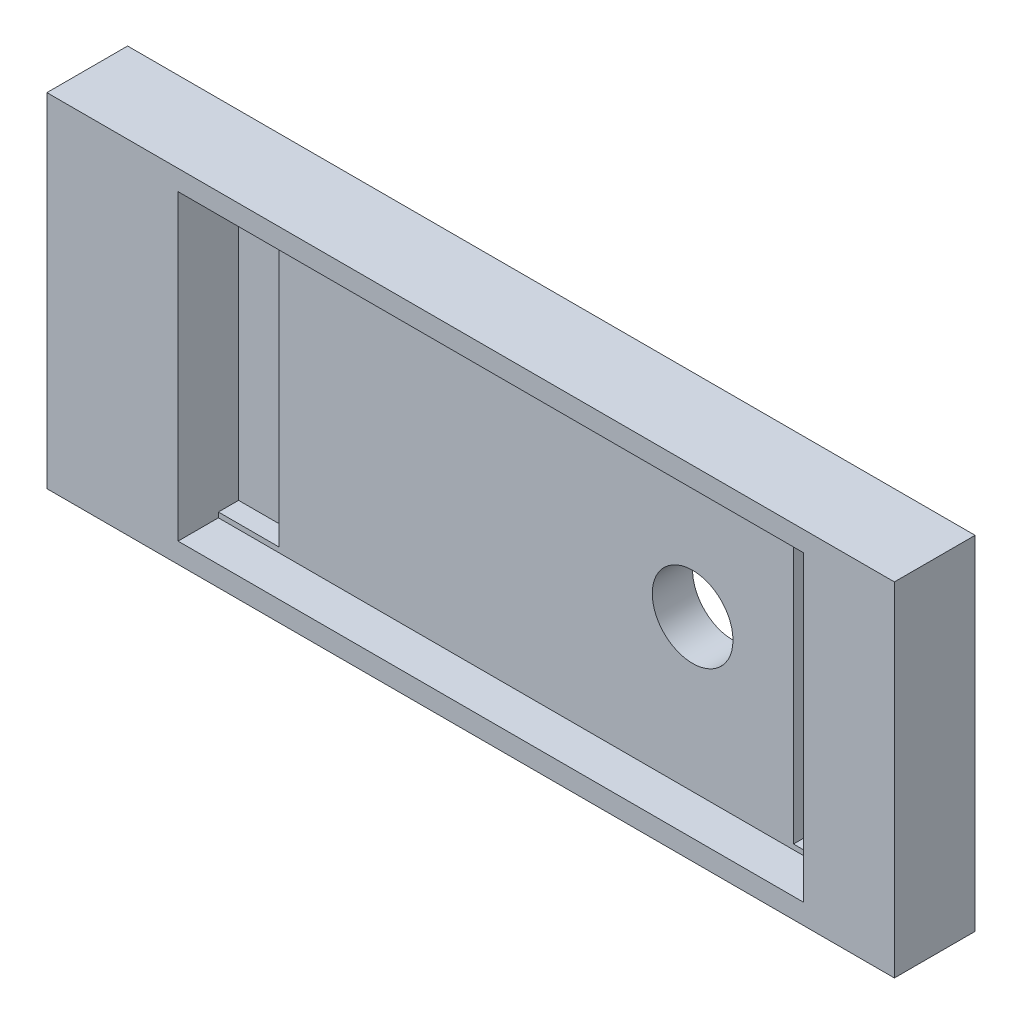
ISO-10303-21;
HEADER;
FILE_DESCRIPTION(('STEP AP214'),'2;1');
FILE_NAME('part.step','',(''),(''),'','','');
FILE_SCHEMA(('AUTOMOTIVE_DESIGN { 1 0 10303 214 1 1 1 1 }'));
ENDSEC;
DATA;
#1=APPLICATION_CONTEXT('core data for automotive mechanical design processes');
#2=APPLICATION_PROTOCOL_DEFINITION('international standard','automotive_design',2000,#1);
#3=PRODUCT_CONTEXT('',#1,'mechanical');
#4=PRODUCT('Part','Part','',(#3));
#5=PRODUCT_RELATED_PRODUCT_CATEGORY('part','',(#4));
#6=PRODUCT_DEFINITION_FORMATION('','',#4);
#7=PRODUCT_DEFINITION_CONTEXT('part definition',#1,'design');
#8=PRODUCT_DEFINITION('design','',#6,#7);
#9=PRODUCT_DEFINITION_SHAPE('','',#8);
#10=(LENGTH_UNIT() NAMED_UNIT(*) SI_UNIT(.MILLI.,.METRE.));
#11=(NAMED_UNIT(*) PLANE_ANGLE_UNIT() SI_UNIT($,.RADIAN.));
#12=(NAMED_UNIT(*) SI_UNIT($,.STERADIAN.) SOLID_ANGLE_UNIT());
#13=UNCERTAINTY_MEASURE_WITH_UNIT(LENGTH_MEASURE(1.E-05),#10,'distance_accuracy_value','');
#14=(GEOMETRIC_REPRESENTATION_CONTEXT(3) GLOBAL_UNCERTAINTY_ASSIGNED_CONTEXT((#13)) GLOBAL_UNIT_ASSIGNED_CONTEXT((#10,
#11,#12)) REPRESENTATION_CONTEXT('',''));
#15=CARTESIAN_POINT('',(0.,0.,0.));
#16=DIRECTION('',(0.,0.,1.));
#17=DIRECTION('',(1.,0.,0.));
#18=AXIS2_PLACEMENT_3D('',#15,#16,#17);
#19=CARTESIAN_POINT('',(0.,0.,2.));
#20=DIRECTION('',(0.,0.,1.));
#21=DIRECTION('',(1.,0.,0.));
#22=AXIS2_PLACEMENT_3D('',#19,#20,#21);
#23=PLANE('',#22);
#24=CARTESIAN_POINT('',(0.,0.,2.));
#25=DIRECTION('',(0.,0.,1.));
#26=DIRECTION('',(1.,0.,0.));
#27=AXIS2_PLACEMENT_3D('',#24,#25,#26);
#28=CIRCLE('',#27,2.);
#29=CARTESIAN_POINT('',(2.,0.,2.));
#30=VERTEX_POINT('',#29);
#31=EDGE_CURVE('E263',#30,#30,#28,.T.);
#32=ORIENTED_EDGE('',*,*,#31,.F.);
#33=EDGE_LOOP('',(#32));
#34=FACE_BOUND('',#33,.T.);
#35=DIRECTION('',(1.,0.,0.));
#36=VECTOR('',#35,1.);
#37=CARTESIAN_POINT('',(-29.,-7.50000000000001,2.));
#38=LINE('',#37,#36);
#39=CARTESIAN_POINT('',(-23.5,-7.50000000000001,2.));
#40=VERTEX_POINT('',#39);
#41=CARTESIAN_POINT('',(7.5,-7.50000000000001,2.));
#42=VERTEX_POINT('',#41);
#43=EDGE_CURVE('E157',#40,#42,#38,.T.);
#44=ORIENTED_EDGE('',*,*,#43,.T.);
#45=DIRECTION('',(0.,-1.,0.));
#46=VECTOR('',#45,1.);
#47=CARTESIAN_POINT('',(7.5,7.5,2.));
#48=LINE('',#47,#46);
#49=CARTESIAN_POINT('',(7.5,-7.25,2.));
#50=VERTEX_POINT('',#49);
#51=EDGE_CURVE('E193',#50,#42,#48,.T.);
#52=ORIENTED_EDGE('',*,*,#51,.F.);
#53=DIRECTION('',(-1.,0.,0.));
#54=VECTOR('',#53,1.);
#55=CARTESIAN_POINT('',(0.,-7.25,2.));
#56=LINE('',#55,#54);
#57=CARTESIAN_POINT('',(5.,-7.25,2.));
#58=VERTEX_POINT('',#57);
#59=EDGE_CURVE('E240',#50,#58,#56,.T.);
#60=ORIENTED_EDGE('',*,*,#59,.T.);
#61=DIRECTION('',(0.,-1.,0.));
#62=VECTOR('',#61,1.);
#63=CARTESIAN_POINT('',(5.,0.,2.));
#64=LINE('',#63,#62);
#65=CARTESIAN_POINT('',(5.,7.25,2.));
#66=VERTEX_POINT('',#65);
#67=EDGE_CURVE('E250',#66,#58,#64,.T.);
#68=ORIENTED_EDGE('',*,*,#67,.F.);
#69=DIRECTION('',(-1.,0.,0.));
#70=VECTOR('',#69,1.);
#71=CARTESIAN_POINT('',(0.,7.25,2.));
#72=LINE('',#71,#70);
#73=CARTESIAN_POINT('',(7.5,7.25,2.));
#74=VERTEX_POINT('',#73);
#75=EDGE_CURVE('E205',#74,#66,#72,.T.);
#76=ORIENTED_EDGE('',*,*,#75,.F.);
#77=CARTESIAN_POINT('',(7.5,7.5,2.));
#78=VERTEX_POINT('',#77);
#79=EDGE_CURVE('E53',#78,#74,#48,.T.);
#80=ORIENTED_EDGE('',*,*,#79,.F.);
#81=DIRECTION('',(-1.,0.,0.));
#82=VECTOR('',#81,1.);
#83=CARTESIAN_POINT('',(11.,7.5,2.));
#84=LINE('',#83,#82);
#85=CARTESIAN_POINT('',(-23.5,7.5,2.));
#86=VERTEX_POINT('',#85);
#87=EDGE_CURVE('E160',#78,#86,#84,.T.);
#88=ORIENTED_EDGE('',*,*,#87,.T.);
#89=DIRECTION('',(0.,1.,0.));
#90=VECTOR('',#89,1.);
#91=CARTESIAN_POINT('',(-23.5,-7.50000000000001,2.));
#92=LINE('',#91,#90);
#93=CARTESIAN_POINT('',(-23.5,7.25,2.));
#94=VERTEX_POINT('',#93);
#95=EDGE_CURVE('E199',#94,#86,#92,.T.);
#96=ORIENTED_EDGE('',*,*,#95,.F.);
#97=DIRECTION('',(-1.,0.,0.));
#98=VECTOR('',#97,1.);
#99=CARTESIAN_POINT('',(0.,7.25,2.));
#100=LINE('',#99,#98);
#101=CARTESIAN_POINT('',(-20.5,7.25,2.));
#102=VERTEX_POINT('',#101);
#103=EDGE_CURVE('E219',#102,#94,#100,.T.);
#104=ORIENTED_EDGE('',*,*,#103,.F.);
#105=DIRECTION('',(0.,-1.,0.));
#106=VECTOR('',#105,1.);
#107=CARTESIAN_POINT('',(-20.5,0.,2.));
#108=LINE('',#107,#106);
#109=CARTESIAN_POINT('',(-20.5,-7.25,2.));
#110=VERTEX_POINT('',#109);
#111=EDGE_CURVE('E210',#102,#110,#108,.T.);
#112=ORIENTED_EDGE('',*,*,#111,.T.);
#113=DIRECTION('',(1.,0.,0.));
#114=VECTOR('',#113,1.);
#115=CARTESIAN_POINT('',(0.,-7.25,2.));
#116=LINE('',#115,#114);
#117=CARTESIAN_POINT('',(-23.5,-7.25,2.));
#118=VERTEX_POINT('',#117);
#119=EDGE_CURVE('E222',#118,#110,#116,.T.);
#120=ORIENTED_EDGE('',*,*,#119,.F.);
#121=EDGE_CURVE('E200',#40,#118,#92,.T.);
#122=ORIENTED_EDGE('',*,*,#121,.F.);
#123=EDGE_LOOP('',(#44,#52,#60,#68,#76,#80,#88,#96,#104,#112,#120,#122));
#124=FACE_BOUND('',#123,.T.);
#125=ADVANCED_FACE('F38',(#34,#124),#23,.T.);
#126=CARTESIAN_POINT('',(11.,7.5,3.));
#127=DIRECTION('',(0.,-1.,0.));
#128=DIRECTION('',(0.,0.,-1.));
#129=AXIS2_PLACEMENT_3D('',#126,#127,#128);
#130=PLANE('',#129);
#131=ORIENTED_EDGE('',*,*,#87,.F.);
#132=DIRECTION('',(0.,0.,-1.));
#133=VECTOR('',#132,1.);
#134=CARTESIAN_POINT('',(7.5,7.5,3.));
#135=LINE('',#134,#133);
#136=CARTESIAN_POINT('',(7.5,7.5,4.));
#137=VERTEX_POINT('',#136);
#138=EDGE_CURVE('E196',#137,#78,#135,.T.);
#139=ORIENTED_EDGE('',*,*,#138,.F.);
#140=DIRECTION('',(-1.,0.,0.));
#141=VECTOR('',#140,1.);
#142=CARTESIAN_POINT('',(-23.5,7.5,4.));
#143=LINE('',#142,#141);
#144=CARTESIAN_POINT('',(-23.5,7.5,4.));
#145=VERTEX_POINT('',#144);
#146=EDGE_CURVE('E177',#137,#145,#143,.T.);
#147=ORIENTED_EDGE('',*,*,#146,.T.);
#148=DIRECTION('',(0.,0.,-1.));
#149=VECTOR('',#148,1.);
#150=CARTESIAN_POINT('',(-23.5,7.5,3.));
#151=LINE('',#150,#149);
#152=EDGE_CURVE('E161',#145,#86,#151,.T.);
#153=ORIENTED_EDGE('',*,*,#152,.T.);
#154=EDGE_LOOP('',(#131,#139,#147,#153));
#155=FACE_BOUND('',#154,.T.);
#156=ADVANCED_FACE('F308',(#155),#130,.T.);
#157=CARTESIAN_POINT('',(-29.,-7.50000000000001,3.));
#158=DIRECTION('',(0.,1.,0.));
#159=DIRECTION('',(0.,0.,1.));
#160=AXIS2_PLACEMENT_3D('',#157,#158,#159);
#161=PLANE('',#160);
#162=DIRECTION('',(0.,0.,-1.));
#163=VECTOR('',#162,1.);
#164=CARTESIAN_POINT('',(-23.5,-7.50000000000001,3.));
#165=LINE('',#164,#163);
#166=CARTESIAN_POINT('',(-23.5,-7.50000000000001,4.));
#167=VERTEX_POINT('',#166);
#168=EDGE_CURVE('E151',#167,#40,#165,.T.);
#169=ORIENTED_EDGE('',*,*,#168,.F.);
#170=DIRECTION('',(1.,0.,0.));
#171=VECTOR('',#170,1.);
#172=CARTESIAN_POINT('',(-23.5,-7.50000000000001,4.));
#173=LINE('',#172,#171);
#174=CARTESIAN_POINT('',(7.5,-7.50000000000001,4.));
#175=VERTEX_POINT('',#174);
#176=EDGE_CURVE('E155',#167,#175,#173,.T.);
#177=ORIENTED_EDGE('',*,*,#176,.T.);
#178=DIRECTION('',(0.,0.,-1.));
#179=VECTOR('',#178,1.);
#180=CARTESIAN_POINT('',(7.5,-7.50000000000001,3.));
#181=LINE('',#180,#179);
#182=EDGE_CURVE('E61',#175,#42,#181,.T.);
#183=ORIENTED_EDGE('',*,*,#182,.T.);
#184=ORIENTED_EDGE('',*,*,#43,.F.);
#185=EDGE_LOOP('',(#169,#177,#183,#184));
#186=FACE_BOUND('',#185,.T.);
#187=ADVANCED_FACE('F153',(#186),#161,.T.);
#188=CARTESIAN_POINT('',(0.,0.,0.));
#189=DIRECTION('',(0.,0.,1.));
#190=DIRECTION('',(1.,0.,0.));
#191=AXIS2_PLACEMENT_3D('',#188,#189,#190);
#192=PLANE('',#191);
#193=DIRECTION('',(0.,1.,0.));
#194=VECTOR('',#193,1.);
#195=CARTESIAN_POINT('',(12.,0.,0.));
#196=LINE('',#195,#194);
#197=CARTESIAN_POINT('',(12.,-8.50000000000001,0.));
#198=VERTEX_POINT('',#197);
#199=CARTESIAN_POINT('',(12.,8.5,0.));
#200=VERTEX_POINT('',#199);
#201=EDGE_CURVE('E266',#198,#200,#196,.T.);
#202=ORIENTED_EDGE('',*,*,#201,.F.);
#203=DIRECTION('',(1.,0.,0.));
#204=VECTOR('',#203,1.);
#205=CARTESIAN_POINT('',(-30.,-8.50000000000001,0.));
#206=LINE('',#205,#204);
#207=CARTESIAN_POINT('',(-30.,-8.50000000000001,0.));
#208=VERTEX_POINT('',#207);
#209=EDGE_CURVE('E274',#208,#198,#206,.T.);
#210=ORIENTED_EDGE('',*,*,#209,.F.);
#211=DIRECTION('',(0.,-1.,0.));
#212=VECTOR('',#211,1.);
#213=CARTESIAN_POINT('',(-30.,8.49999999999999,0.));
#214=LINE('',#213,#212);
#215=CARTESIAN_POINT('',(-30.,8.49999999999999,0.));
#216=VERTEX_POINT('',#215);
#217=EDGE_CURVE('E272',#216,#208,#214,.T.);
#218=ORIENTED_EDGE('',*,*,#217,.F.);
#219=DIRECTION('',(-1.,0.,0.));
#220=VECTOR('',#219,1.);
#221=CARTESIAN_POINT('',(12.,8.5,0.));
#222=LINE('',#221,#220);
#223=EDGE_CURVE('E270',#200,#216,#222,.T.);
#224=ORIENTED_EDGE('',*,*,#223,.F.);
#225=EDGE_LOOP('',(#202,#210,#218,#224));
#226=FACE_BOUND('',#225,.T.);
#227=CARTESIAN_POINT('',(0.,0.,0.));
#228=DIRECTION('',(0.,0.,1.));
#229=DIRECTION('',(1.,0.,0.));
#230=AXIS2_PLACEMENT_3D('',#227,#228,#229);
#231=CIRCLE('',#230,2.);
#232=CARTESIAN_POINT('',(2.,0.,0.));
#233=VERTEX_POINT('',#232);
#234=EDGE_CURVE('E230',#233,#233,#231,.T.);
#235=ORIENTED_EDGE('',*,*,#234,.T.);
#236=EDGE_LOOP('',(#235));
#237=FACE_BOUND('',#236,.T.);
#238=ADVANCED_FACE('F292',(#226,#237),#192,.F.);
#239=CARTESIAN_POINT('',(12.,0.,2.));
#240=DIRECTION('',(-1.,0.,0.));
#241=DIRECTION('',(0.,0.,1.));
#242=AXIS2_PLACEMENT_3D('',#239,#240,#241);
#243=PLANE('',#242);
#244=ORIENTED_EDGE('',*,*,#201,.T.);
#245=DIRECTION('',(0.,0.,-1.));
#246=VECTOR('',#245,1.);
#247=CARTESIAN_POINT('',(12.,8.5,2.));
#248=LINE('',#247,#246);
#249=CARTESIAN_POINT('',(12.,8.5,4.));
#250=VERTEX_POINT('',#249);
#251=EDGE_CURVE('E11',#250,#200,#248,.T.);
#252=ORIENTED_EDGE('',*,*,#251,.F.);
#253=DIRECTION('',(0.,1.,0.));
#254=VECTOR('',#253,1.);
#255=CARTESIAN_POINT('',(12.,-8.50000000000001,4.));
#256=LINE('',#255,#254);
#257=CARTESIAN_POINT('',(12.,-8.50000000000001,4.));
#258=VERTEX_POINT('',#257);
#259=EDGE_CURVE('E187',#258,#250,#256,.T.);
#260=ORIENTED_EDGE('',*,*,#259,.F.);
#261=DIRECTION('',(0.,0.,-1.));
#262=VECTOR('',#261,1.);
#263=CARTESIAN_POINT('',(12.,-8.50000000000001,2.));
#264=LINE('',#263,#262);
#265=EDGE_CURVE('E277',#258,#198,#264,.T.);
#266=ORIENTED_EDGE('',*,*,#265,.T.);
#267=EDGE_LOOP('',(#244,#252,#260,#266));
#268=FACE_BOUND('',#267,.T.);
#269=ADVANCED_FACE('F40',(#268),#243,.F.);
#270=CARTESIAN_POINT('',(12.,8.5,2.));
#271=DIRECTION('',(0.,-1.,0.));
#272=DIRECTION('',(1.,0.,0.));
#273=AXIS2_PLACEMENT_3D('',#270,#271,#272);
#274=PLANE('',#273);
#275=ORIENTED_EDGE('',*,*,#223,.T.);
#276=DIRECTION('',(0.,0.,-1.));
#277=VECTOR('',#276,1.);
#278=CARTESIAN_POINT('',(-30.,8.49999999999999,2.));
#279=LINE('',#278,#277);
#280=CARTESIAN_POINT('',(-30.,8.49999999999999,4.));
#281=VERTEX_POINT('',#280);
#282=EDGE_CURVE('E46',#281,#216,#279,.T.);
#283=ORIENTED_EDGE('',*,*,#282,.F.);
#284=DIRECTION('',(-1.,0.,0.));
#285=VECTOR('',#284,1.);
#286=CARTESIAN_POINT('',(12.,8.5,4.));
#287=LINE('',#286,#285);
#288=EDGE_CURVE('E190',#250,#281,#287,.T.);
#289=ORIENTED_EDGE('',*,*,#288,.F.);
#290=ORIENTED_EDGE('',*,*,#251,.T.);
#291=EDGE_LOOP('',(#275,#283,#289,#290));
#292=FACE_BOUND('',#291,.T.);
#293=ADVANCED_FACE('F300',(#292),#274,.F.);
#294=CARTESIAN_POINT('',(-30.,8.49999999999999,2.));
#295=DIRECTION('',(1.,0.,0.));
#296=DIRECTION('',(0.,1.,0.));
#297=AXIS2_PLACEMENT_3D('',#294,#295,#296);
#298=PLANE('',#297);
#299=ORIENTED_EDGE('',*,*,#217,.T.);
#300=DIRECTION('',(0.,0.,-1.));
#301=VECTOR('',#300,1.);
#302=CARTESIAN_POINT('',(-30.,-8.50000000000001,2.));
#303=LINE('',#302,#301);
#304=CARTESIAN_POINT('',(-30.,-8.50000000000001,4.));
#305=VERTEX_POINT('',#304);
#306=EDGE_CURVE('E280',#305,#208,#303,.T.);
#307=ORIENTED_EDGE('',*,*,#306,.F.);
#308=DIRECTION('',(0.,-1.,0.));
#309=VECTOR('',#308,1.);
#310=CARTESIAN_POINT('',(-30.,8.49999999999999,4.));
#311=LINE('',#310,#309);
#312=EDGE_CURVE('E181',#281,#305,#311,.T.);
#313=ORIENTED_EDGE('',*,*,#312,.F.);
#314=ORIENTED_EDGE('',*,*,#282,.T.);
#315=EDGE_LOOP('',(#299,#307,#313,#314));
#316=FACE_BOUND('',#315,.T.);
#317=ADVANCED_FACE('F286',(#316),#298,.F.);
#318=CARTESIAN_POINT('',(-30.,-8.50000000000001,2.));
#319=DIRECTION('',(0.,1.,0.));
#320=DIRECTION('',(0.,0.,1.));
#321=AXIS2_PLACEMENT_3D('',#318,#319,#320);
#322=PLANE('',#321);
#323=ORIENTED_EDGE('',*,*,#209,.T.);
#324=ORIENTED_EDGE('',*,*,#265,.F.);
#325=DIRECTION('',(1.,0.,0.));
#326=VECTOR('',#325,1.);
#327=CARTESIAN_POINT('',(-30.,-8.50000000000001,4.));
#328=LINE('',#327,#326);
#329=EDGE_CURVE('E184',#305,#258,#328,.T.);
#330=ORIENTED_EDGE('',*,*,#329,.F.);
#331=ORIENTED_EDGE('',*,*,#306,.T.);
#332=EDGE_LOOP('',(#323,#324,#330,#331));
#333=FACE_BOUND('',#332,.T.);
#334=ADVANCED_FACE('F295',(#333),#322,.F.);
#335=CARTESIAN_POINT('',(0.,0.,2.));
#336=DIRECTION('',(0.,0.,-1.));
#337=DIRECTION('',(-1.,0.,0.));
#338=AXIS2_PLACEMENT_3D('',#335,#336,#337);
#339=CYLINDRICAL_SURFACE('',#338,2.);
#340=ORIENTED_EDGE('',*,*,#31,.T.);
#341=EDGE_LOOP('',(#340));
#342=FACE_BOUND('',#341,.T.);
#343=ORIENTED_EDGE('',*,*,#234,.F.);
#344=EDGE_LOOP('',(#343));
#345=FACE_BOUND('',#344,.T.);
#346=ADVANCED_FACE('F319',(#342,#345),#339,.F.);
#347=CARTESIAN_POINT('',(0.,7.25,1.));
#348=DIRECTION('',(0.,1.,0.));
#349=DIRECTION('',(0.,0.,1.));
#350=AXIS2_PLACEMENT_3D('',#347,#348,#349);
#351=PLANE('',#350);
#352=ORIENTED_EDGE('',*,*,#75,.T.);
#353=DIRECTION('',(0.,0.,1.));
#354=VECTOR('',#353,1.);
#355=CARTESIAN_POINT('',(5.,7.25,1.));
#356=LINE('',#355,#354);
#357=CARTESIAN_POINT('',(5.,7.25,1.));
#358=VERTEX_POINT('',#357);
#359=EDGE_CURVE('E248',#358,#66,#356,.T.);
#360=ORIENTED_EDGE('',*,*,#359,.F.);
#361=DIRECTION('',(-1.,0.,0.));
#362=VECTOR('',#361,1.);
#363=CARTESIAN_POINT('',(0.,7.25,1.));
#364=LINE('',#363,#362);
#365=CARTESIAN_POINT('',(7.5,7.25,1.));
#366=VERTEX_POINT('',#365);
#367=EDGE_CURVE('E236',#366,#358,#364,.T.);
#368=ORIENTED_EDGE('',*,*,#367,.F.);
#369=DIRECTION('',(0.,0.,1.));
#370=VECTOR('',#369,1.);
#371=CARTESIAN_POINT('',(7.5,7.25,1.));
#372=LINE('',#371,#370);
#373=EDGE_CURVE('E223',#366,#74,#372,.T.);
#374=ORIENTED_EDGE('',*,*,#373,.T.);
#375=EDGE_LOOP('',(#352,#360,#368,#374));
#376=FACE_BOUND('',#375,.T.);
#377=ADVANCED_FACE('F327',(#376),#351,.F.);
#378=CARTESIAN_POINT('',(7.5,0.,1.));
#379=DIRECTION('',(1.,0.,0.));
#380=DIRECTION('',(0.,0.,-1.));
#381=AXIS2_PLACEMENT_3D('',#378,#379,#380);
#382=PLANE('',#381);
#383=DIRECTION('',(0.,0.,1.));
#384=VECTOR('',#383,1.);
#385=CARTESIAN_POINT('',(7.5,-7.25,1.));
#386=LINE('',#385,#384);
#387=CARTESIAN_POINT('',(7.5,-7.25,1.));
#388=VERTEX_POINT('',#387);
#389=EDGE_CURVE('E256',#388,#50,#386,.T.);
#390=ORIENTED_EDGE('',*,*,#389,.T.);
#391=ORIENTED_EDGE('',*,*,#51,.T.);
#392=ORIENTED_EDGE('',*,*,#182,.F.);
#393=DIRECTION('',(0.,1.,0.));
#394=VECTOR('',#393,1.);
#395=CARTESIAN_POINT('',(7.5,7.5,4.));
#396=LINE('',#395,#394);
#397=EDGE_CURVE('E175',#175,#137,#396,.T.);
#398=ORIENTED_EDGE('',*,*,#397,.T.);
#399=ORIENTED_EDGE('',*,*,#138,.T.);
#400=ORIENTED_EDGE('',*,*,#79,.T.);
#401=ORIENTED_EDGE('',*,*,#373,.F.);
#402=DIRECTION('',(0.,1.,0.));
#403=VECTOR('',#402,1.);
#404=CARTESIAN_POINT('',(7.5,0.,1.));
#405=LINE('',#404,#403);
#406=EDGE_CURVE('E245',#388,#366,#405,.T.);
#407=ORIENTED_EDGE('',*,*,#406,.F.);
#408=EDGE_LOOP('',(#390,#391,#392,#398,#399,#400,#401,#407));
#409=FACE_BOUND('',#408,.T.);
#410=ADVANCED_FACE('F332',(#409),#382,.F.);
#411=CARTESIAN_POINT('',(0.,-7.25,1.));
#412=DIRECTION('',(0.,1.,0.));
#413=DIRECTION('',(0.,0.,1.));
#414=AXIS2_PLACEMENT_3D('',#411,#412,#413);
#415=PLANE('',#414);
#416=ORIENTED_EDGE('',*,*,#59,.F.);
#417=ORIENTED_EDGE('',*,*,#389,.F.);
#418=DIRECTION('',(-1.,0.,0.));
#419=VECTOR('',#418,1.);
#420=CARTESIAN_POINT('',(0.,-7.25,1.));
#421=LINE('',#420,#419);
#422=CARTESIAN_POINT('',(5.,-7.25,1.));
#423=VERTEX_POINT('',#422);
#424=EDGE_CURVE('E243',#388,#423,#421,.T.);
#425=ORIENTED_EDGE('',*,*,#424,.T.);
#426=DIRECTION('',(0.,0.,1.));
#427=VECTOR('',#426,1.);
#428=CARTESIAN_POINT('',(5.,-7.25,1.));
#429=LINE('',#428,#427);
#430=EDGE_CURVE('E259',#423,#58,#429,.T.);
#431=ORIENTED_EDGE('',*,*,#430,.T.);
#432=EDGE_LOOP('',(#416,#417,#425,#431));
#433=FACE_BOUND('',#432,.T.);
#434=ADVANCED_FACE('F339',(#433),#415,.T.);
#435=CARTESIAN_POINT('',(5.,0.,1.));
#436=DIRECTION('',(-1.,0.,0.));
#437=DIRECTION('',(0.,-1.,0.));
#438=AXIS2_PLACEMENT_3D('',#435,#436,#437);
#439=PLANE('',#438);
#440=ORIENTED_EDGE('',*,*,#67,.T.);
#441=ORIENTED_EDGE('',*,*,#430,.F.);
#442=DIRECTION('',(0.,-1.,0.));
#443=VECTOR('',#442,1.);
#444=CARTESIAN_POINT('',(5.,0.,1.));
#445=LINE('',#444,#443);
#446=EDGE_CURVE('E239',#358,#423,#445,.T.);
#447=ORIENTED_EDGE('',*,*,#446,.F.);
#448=ORIENTED_EDGE('',*,*,#359,.T.);
#449=EDGE_LOOP('',(#440,#441,#447,#448));
#450=FACE_BOUND('',#449,.T.);
#451=ADVANCED_FACE('F343',(#450),#439,.F.);
#452=CARTESIAN_POINT('',(0.,0.,1.));
#453=DIRECTION('',(0.,0.,1.));
#454=DIRECTION('',(1.,0.,0.));
#455=AXIS2_PLACEMENT_3D('',#452,#453,#454);
#456=PLANE('',#455);
#457=ORIENTED_EDGE('',*,*,#367,.T.);
#458=ORIENTED_EDGE('',*,*,#446,.T.);
#459=ORIENTED_EDGE('',*,*,#424,.F.);
#460=ORIENTED_EDGE('',*,*,#406,.T.);
#461=EDGE_LOOP('',(#457,#458,#459,#460));
#462=FACE_BOUND('',#461,.T.);
#463=ADVANCED_FACE('F346',(#462),#456,.T.);
#464=CARTESIAN_POINT('',(0.,7.25,1.));
#465=DIRECTION('',(0.,1.,0.));
#466=DIRECTION('',(0.,0.,1.));
#467=AXIS2_PLACEMENT_3D('',#464,#465,#466);
#468=PLANE('',#467);
#469=ORIENTED_EDGE('',*,*,#103,.T.);
#470=DIRECTION('',(0.,0.,1.));
#471=VECTOR('',#470,1.);
#472=CARTESIAN_POINT('',(-23.5,7.25,1.));
#473=LINE('',#472,#471);
#474=CARTESIAN_POINT('',(-23.5,7.25,1.));
#475=VERTEX_POINT('',#474);
#476=EDGE_CURVE('E218',#475,#94,#473,.T.);
#477=ORIENTED_EDGE('',*,*,#476,.F.);
#478=DIRECTION('',(-1.,0.,0.));
#479=VECTOR('',#478,1.);
#480=CARTESIAN_POINT('',(0.,7.25,1.));
#481=LINE('',#480,#479);
#482=CARTESIAN_POINT('',(-20.5,7.25,1.));
#483=VERTEX_POINT('',#482);
#484=EDGE_CURVE('E206',#483,#475,#481,.T.);
#485=ORIENTED_EDGE('',*,*,#484,.F.);
#486=DIRECTION('',(0.,0.,1.));
#487=VECTOR('',#486,1.);
#488=CARTESIAN_POINT('',(-20.5,7.25,1.));
#489=LINE('',#488,#487);
#490=EDGE_CURVE('E228',#483,#102,#489,.T.);
#491=ORIENTED_EDGE('',*,*,#490,.T.);
#492=EDGE_LOOP('',(#469,#477,#485,#491));
#493=FACE_BOUND('',#492,.T.);
#494=ADVANCED_FACE('F353',(#493),#468,.F.);
#495=CARTESIAN_POINT('',(-20.5,0.,1.));
#496=DIRECTION('',(-1.,0.,0.));
#497=DIRECTION('',(0.,-1.,0.));
#498=AXIS2_PLACEMENT_3D('',#495,#496,#497);
#499=PLANE('',#498);
#500=ORIENTED_EDGE('',*,*,#111,.F.);
#501=ORIENTED_EDGE('',*,*,#490,.F.);
#502=DIRECTION('',(0.,-1.,0.));
#503=VECTOR('',#502,1.);
#504=CARTESIAN_POINT('',(-20.5,0.,1.));
#505=LINE('',#504,#503);
#506=CARTESIAN_POINT('',(-20.5,-7.25,1.));
#507=VERTEX_POINT('',#506);
#508=EDGE_CURVE('E216',#483,#507,#505,.T.);
#509=ORIENTED_EDGE('',*,*,#508,.T.);
#510=DIRECTION('',(0.,0.,1.));
#511=VECTOR('',#510,1.);
#512=CARTESIAN_POINT('',(-20.5,-7.25,1.));
#513=LINE('',#512,#511);
#514=EDGE_CURVE('E231',#507,#110,#513,.T.);
#515=ORIENTED_EDGE('',*,*,#514,.T.);
#516=EDGE_LOOP('',(#500,#501,#509,#515));
#517=FACE_BOUND('',#516,.T.);
#518=ADVANCED_FACE('F357',(#517),#499,.T.);
#519=CARTESIAN_POINT('',(0.,-7.25,1.));
#520=DIRECTION('',(0.,-1.,0.));
#521=DIRECTION('',(0.,0.,-1.));
#522=AXIS2_PLACEMENT_3D('',#519,#520,#521);
#523=PLANE('',#522);
#524=ORIENTED_EDGE('',*,*,#119,.T.);
#525=ORIENTED_EDGE('',*,*,#514,.F.);
#526=DIRECTION('',(1.,0.,0.));
#527=VECTOR('',#526,1.);
#528=CARTESIAN_POINT('',(0.,-7.25,1.));
#529=LINE('',#528,#527);
#530=CARTESIAN_POINT('',(-23.5,-7.25,1.));
#531=VERTEX_POINT('',#530);
#532=EDGE_CURVE('E213',#531,#507,#529,.T.);
#533=ORIENTED_EDGE('',*,*,#532,.F.);
#534=DIRECTION('',(0.,0.,1.));
#535=VECTOR('',#534,1.);
#536=CARTESIAN_POINT('',(-23.5,-7.25,1.));
#537=LINE('',#536,#535);
#538=EDGE_CURVE('E233',#531,#118,#537,.T.);
#539=ORIENTED_EDGE('',*,*,#538,.T.);
#540=EDGE_LOOP('',(#524,#525,#533,#539));
#541=FACE_BOUND('',#540,.T.);
#542=ADVANCED_FACE('F362',(#541),#523,.F.);
#543=CARTESIAN_POINT('',(-23.5,0.,1.));
#544=DIRECTION('',(-1.,0.,0.));
#545=DIRECTION('',(0.,0.,1.));
#546=AXIS2_PLACEMENT_3D('',#543,#544,#545);
#547=PLANE('',#546);
#548=ORIENTED_EDGE('',*,*,#476,.T.);
#549=ORIENTED_EDGE('',*,*,#95,.T.);
#550=ORIENTED_EDGE('',*,*,#152,.F.);
#551=DIRECTION('',(0.,-1.,0.));
#552=VECTOR('',#551,1.);
#553=CARTESIAN_POINT('',(-23.5,7.5,4.));
#554=LINE('',#553,#552);
#555=EDGE_CURVE('E164',#145,#167,#554,.T.);
#556=ORIENTED_EDGE('',*,*,#555,.T.);
#557=ORIENTED_EDGE('',*,*,#168,.T.);
#558=ORIENTED_EDGE('',*,*,#121,.T.);
#559=ORIENTED_EDGE('',*,*,#538,.F.);
#560=DIRECTION('',(0.,-1.,0.));
#561=VECTOR('',#560,1.);
#562=CARTESIAN_POINT('',(-23.5,0.,1.));
#563=LINE('',#562,#561);
#564=EDGE_CURVE('E209',#475,#531,#563,.T.);
#565=ORIENTED_EDGE('',*,*,#564,.F.);
#566=EDGE_LOOP('',(#548,#549,#550,#556,#557,#558,#559,#565));
#567=FACE_BOUND('',#566,.T.);
#568=ADVANCED_FACE('F166',(#567),#547,.F.);
#569=CARTESIAN_POINT('',(0.,0.,1.));
#570=DIRECTION('',(0.,0.,1.));
#571=DIRECTION('',(1.,0.,0.));
#572=AXIS2_PLACEMENT_3D('',#569,#570,#571);
#573=PLANE('',#572);
#574=ORIENTED_EDGE('',*,*,#484,.T.);
#575=ORIENTED_EDGE('',*,*,#564,.T.);
#576=ORIENTED_EDGE('',*,*,#532,.T.);
#577=ORIENTED_EDGE('',*,*,#508,.F.);
#578=EDGE_LOOP('',(#574,#575,#576,#577));
#579=FACE_BOUND('',#578,.T.);
#580=ADVANCED_FACE('F361',(#579),#573,.T.);
#581=CARTESIAN_POINT('',(0.,0.,4.));
#582=DIRECTION('',(0.,0.,1.));
#583=DIRECTION('',(1.,0.,0.));
#584=AXIS2_PLACEMENT_3D('',#581,#582,#583);
#585=PLANE('',#584);
#586=ORIENTED_EDGE('',*,*,#312,.T.);
#587=ORIENTED_EDGE('',*,*,#329,.T.);
#588=ORIENTED_EDGE('',*,*,#259,.T.);
#589=ORIENTED_EDGE('',*,*,#288,.T.);
#590=EDGE_LOOP('',(#586,#587,#588,#589));
#591=FACE_BOUND('',#590,.T.);
#592=ORIENTED_EDGE('',*,*,#176,.F.);
#593=ORIENTED_EDGE('',*,*,#555,.F.);
#594=ORIENTED_EDGE('',*,*,#146,.F.);
#595=ORIENTED_EDGE('',*,*,#397,.F.);
#596=EDGE_LOOP('',(#592,#593,#594,#595));
#597=FACE_BOUND('',#596,.T.);
#598=ADVANCED_FACE('F173',(#591,#597),#585,.T.);
#599=CLOSED_SHELL('',(#125,#156,#187,#238,#269,#293,#317,#334,#346,#377,#410,#434,#451,#463,
#494,#518,#542,#568,#580,#598));
#600=MANIFOLD_SOLID_BREP('B2',#599);
#601=ADVANCED_BREP_SHAPE_REPRESENTATION('',(#18,#600),#14);
#602=SHAPE_DEFINITION_REPRESENTATION(#9,#601);
ENDSEC;
END-ISO-10303-21;
